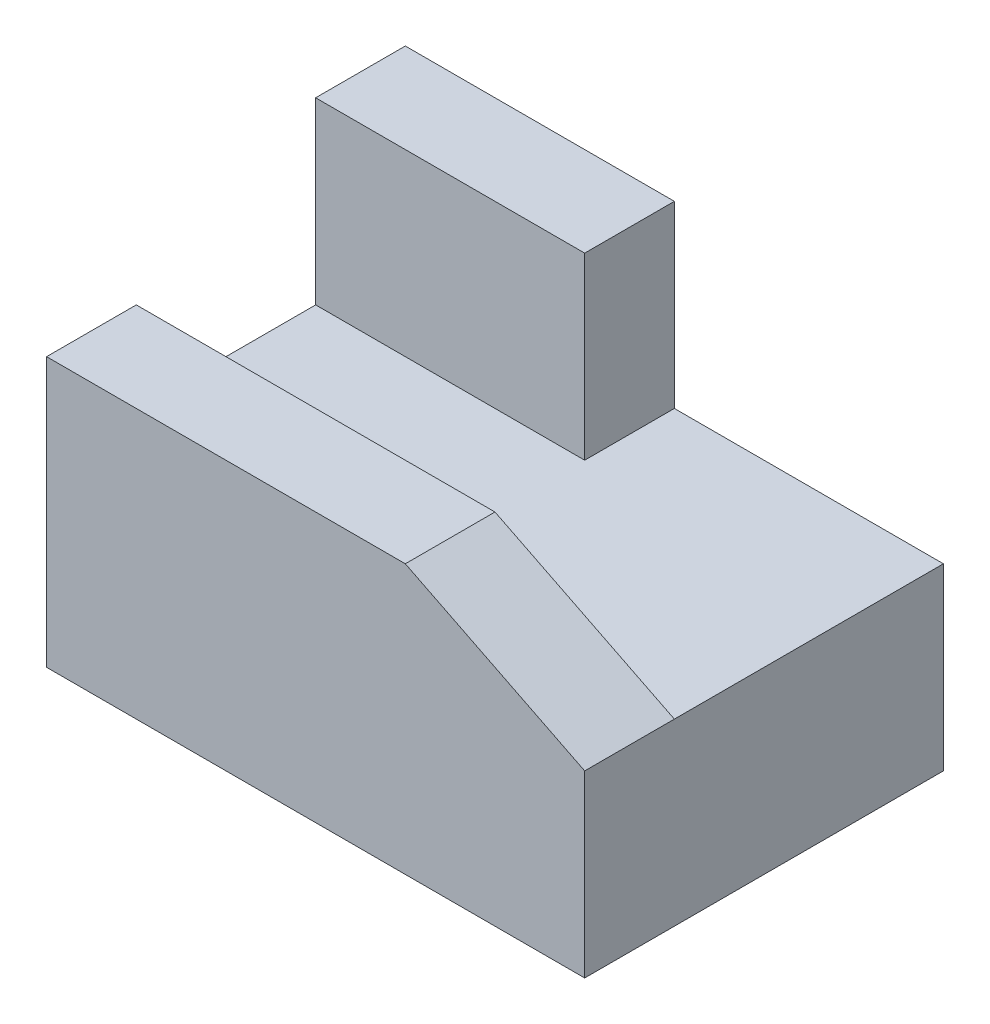
ISO-10303-21;
HEADER;
FILE_DESCRIPTION(('STEP AP214'),'2;1');
FILE_NAME('part.step','',(''),(''),'','','');
FILE_SCHEMA(('AUTOMOTIVE_DESIGN { 1 0 10303 214 1 1 1 1 }'));
ENDSEC;
DATA;
#1=APPLICATION_CONTEXT('core data for automotive mechanical design processes');
#2=APPLICATION_PROTOCOL_DEFINITION('international standard','automotive_design',2000,#1);
#3=PRODUCT_CONTEXT('',#1,'mechanical');
#4=PRODUCT('Part','Part','',(#3));
#5=PRODUCT_RELATED_PRODUCT_CATEGORY('part','',(#4));
#6=PRODUCT_DEFINITION_FORMATION('','',#4);
#7=PRODUCT_DEFINITION_CONTEXT('part definition',#1,'design');
#8=PRODUCT_DEFINITION('design','',#6,#7);
#9=PRODUCT_DEFINITION_SHAPE('','',#8);
#10=(LENGTH_UNIT() NAMED_UNIT(*) SI_UNIT(.MILLI.,.METRE.));
#11=(NAMED_UNIT(*) PLANE_ANGLE_UNIT() SI_UNIT($,.RADIAN.));
#12=(NAMED_UNIT(*) SI_UNIT($,.STERADIAN.) SOLID_ANGLE_UNIT());
#13=UNCERTAINTY_MEASURE_WITH_UNIT(LENGTH_MEASURE(1.E-05),#10,'distance_accuracy_value','');
#14=(GEOMETRIC_REPRESENTATION_CONTEXT(3) GLOBAL_UNCERTAINTY_ASSIGNED_CONTEXT((#13)) GLOBAL_UNIT_ASSIGNED_CONTEXT((#10,
#11,#12)) REPRESENTATION_CONTEXT('',''));
#15=CARTESIAN_POINT('',(0.,0.,0.));
#16=DIRECTION('',(0.,0.,1.));
#17=DIRECTION('',(1.,0.,0.));
#18=AXIS2_PLACEMENT_3D('',#15,#16,#17);
#19=CARTESIAN_POINT('',(0.,20.,0.));
#20=DIRECTION('',(0.,1.,0.));
#21=DIRECTION('',(0.,0.,1.));
#22=AXIS2_PLACEMENT_3D('',#19,#20,#21);
#23=PLANE('',#22);
#24=DIRECTION('',(-1.,0.,0.));
#25=VECTOR('',#24,1.);
#26=CARTESIAN_POINT('',(-30.,20.,-20.));
#27=LINE('',#26,#25);
#28=CARTESIAN_POINT('',(30.,20.,-20.));
#29=VERTEX_POINT('',#28);
#30=CARTESIAN_POINT('',(0.,20.,-20.));
#31=VERTEX_POINT('',#30);
#32=EDGE_CURVE('E186',#29,#31,#27,.T.);
#33=ORIENTED_EDGE('',*,*,#32,.T.);
#34=DIRECTION('',(0.,0.,-1.));
#35=VECTOR('',#34,1.);
#36=CARTESIAN_POINT('',(0.,20.,-10.));
#37=LINE('',#36,#35);
#38=CARTESIAN_POINT('',(0.,20.,-10.));
#39=VERTEX_POINT('',#38);
#40=EDGE_CURVE('E55',#39,#31,#37,.T.);
#41=ORIENTED_EDGE('',*,*,#40,.F.);
#42=DIRECTION('',(1.,0.,0.));
#43=VECTOR('',#42,1.);
#44=CARTESIAN_POINT('',(-30.,20.,-10.));
#45=LINE('',#44,#43);
#46=CARTESIAN_POINT('',(-30.,20.,-10.));
#47=VERTEX_POINT('',#46);
#48=EDGE_CURVE('E60',#47,#39,#45,.T.);
#49=ORIENTED_EDGE('',*,*,#48,.F.);
#50=DIRECTION('',(0.,0.,1.));
#51=VECTOR('',#50,1.);
#52=CARTESIAN_POINT('',(-30.,20.,-20.));
#53=LINE('',#52,#51);
#54=CARTESIAN_POINT('',(-30.,20.,9.99999999999999));
#55=VERTEX_POINT('',#54);
#56=EDGE_CURVE('E190',#47,#55,#53,.T.);
#57=ORIENTED_EDGE('',*,*,#56,.T.);
#58=DIRECTION('',(-1.,0.,0.));
#59=VECTOR('',#58,1.);
#60=CARTESIAN_POINT('',(30.,20.,9.99999999999999));
#61=LINE('',#60,#59);
#62=CARTESIAN_POINT('',(30.,20.,9.99999999999999));
#63=VERTEX_POINT('',#62);
#64=EDGE_CURVE('E164',#63,#55,#61,.T.);
#65=ORIENTED_EDGE('',*,*,#64,.F.);
#66=DIRECTION('',(0.,0.,-1.));
#67=VECTOR('',#66,1.);
#68=CARTESIAN_POINT('',(30.,20.,-20.));
#69=LINE('',#68,#67);
#70=EDGE_CURVE('E187',#63,#29,#69,.T.);
#71=ORIENTED_EDGE('',*,*,#70,.T.);
#72=EDGE_LOOP('',(#33,#41,#49,#57,#65,#71));
#73=FACE_BOUND('',#72,.T.);
#74=ADVANCED_FACE('F39',(#73),#23,.T.);
#75=CARTESIAN_POINT('',(30.,20.,-20.));
#76=DIRECTION('',(-1.,0.,0.));
#77=DIRECTION('',(0.,0.,1.));
#78=AXIS2_PLACEMENT_3D('',#75,#76,#77);
#79=PLANE('',#78);
#80=DIRECTION('',(0.,0.,-1.));
#81=VECTOR('',#80,1.);
#82=CARTESIAN_POINT('',(30.,0.,-20.));
#83=LINE('',#82,#81);
#84=CARTESIAN_POINT('',(30.,0.,20.));
#85=VERTEX_POINT('',#84);
#86=CARTESIAN_POINT('',(30.,0.,-20.));
#87=VERTEX_POINT('',#86);
#88=EDGE_CURVE('E181',#85,#87,#83,.T.);
#89=ORIENTED_EDGE('',*,*,#88,.T.);
#90=DIRECTION('',(0.,-1.,0.));
#91=VECTOR('',#90,1.);
#92=CARTESIAN_POINT('',(30.,20.,-20.));
#93=LINE('',#92,#91);
#94=EDGE_CURVE('E11',#29,#87,#93,.T.);
#95=ORIENTED_EDGE('',*,*,#94,.F.);
#96=ORIENTED_EDGE('',*,*,#70,.F.);
#97=CARTESIAN_POINT('',(30.,20.,20.));
#98=VERTEX_POINT('',#97);
#99=EDGE_CURVE('E182',#98,#63,#69,.T.);
#100=ORIENTED_EDGE('',*,*,#99,.F.);
#101=DIRECTION('',(0.,-1.,0.));
#102=VECTOR('',#101,1.);
#103=CARTESIAN_POINT('',(30.,20.,20.));
#104=LINE('',#103,#102);
#105=EDGE_CURVE('E193',#98,#85,#104,.T.);
#106=ORIENTED_EDGE('',*,*,#105,.T.);
#107=EDGE_LOOP('',(#89,#95,#96,#100,#106));
#108=FACE_BOUND('',#107,.T.);
#109=ADVANCED_FACE('F41',(#108),#79,.F.);
#110=CARTESIAN_POINT('',(-30.,20.,-20.));
#111=DIRECTION('',(0.,0.,1.));
#112=DIRECTION('',(1.,0.,0.));
#113=AXIS2_PLACEMENT_3D('',#110,#111,#112);
#114=PLANE('',#113);
#115=DIRECTION('',(-1.,0.,0.));
#116=VECTOR('',#115,1.);
#117=CARTESIAN_POINT('',(-30.,0.,-20.));
#118=LINE('',#117,#116);
#119=CARTESIAN_POINT('',(-30.,0.,-20.));
#120=VERTEX_POINT('',#119);
#121=EDGE_CURVE('E197',#87,#120,#118,.T.);
#122=ORIENTED_EDGE('',*,*,#121,.T.);
#123=DIRECTION('',(0.,-1.,0.));
#124=VECTOR('',#123,1.);
#125=CARTESIAN_POINT('',(-30.,20.,-20.));
#126=LINE('',#125,#124);
#127=CARTESIAN_POINT('',(-30.,40.,-20.));
#128=VERTEX_POINT('',#127);
#129=EDGE_CURVE('E48',#128,#120,#126,.T.);
#130=ORIENTED_EDGE('',*,*,#129,.F.);
#131=DIRECTION('',(1.,0.,0.));
#132=VECTOR('',#131,1.);
#133=CARTESIAN_POINT('',(-30.,40.,-20.));
#134=LINE('',#133,#132);
#135=CARTESIAN_POINT('',(0.,40.,-20.));
#136=VERTEX_POINT('',#135);
#137=EDGE_CURVE('E144',#128,#136,#134,.T.);
#138=ORIENTED_EDGE('',*,*,#137,.T.);
#139=DIRECTION('',(0.,1.,0.));
#140=VECTOR('',#139,1.);
#141=CARTESIAN_POINT('',(0.,20.,-20.));
#142=LINE('',#141,#140);
#143=EDGE_CURVE('E126',#31,#136,#142,.T.);
#144=ORIENTED_EDGE('',*,*,#143,.F.);
#145=ORIENTED_EDGE('',*,*,#32,.F.);
#146=ORIENTED_EDGE('',*,*,#94,.T.);
#147=EDGE_LOOP('',(#122,#130,#138,#144,#145,#146));
#148=FACE_BOUND('',#147,.T.);
#149=ADVANCED_FACE('F242',(#148),#114,.F.);
#150=CARTESIAN_POINT('',(-30.,20.,-20.));
#151=DIRECTION('',(1.,0.,0.));
#152=DIRECTION('',(0.,0.,-1.));
#153=AXIS2_PLACEMENT_3D('',#150,#151,#152);
#154=PLANE('',#153);
#155=DIRECTION('',(0.,0.,1.));
#156=VECTOR('',#155,1.);
#157=CARTESIAN_POINT('',(-30.,0.,-20.));
#158=LINE('',#157,#156);
#159=CARTESIAN_POINT('',(-30.,0.,20.));
#160=VERTEX_POINT('',#159);
#161=EDGE_CURVE('E200',#120,#160,#158,.T.);
#162=ORIENTED_EDGE('',*,*,#161,.T.);
#163=DIRECTION('',(0.,-1.,0.));
#164=VECTOR('',#163,1.);
#165=CARTESIAN_POINT('',(-30.,20.,20.));
#166=LINE('',#165,#164);
#167=CARTESIAN_POINT('',(-30.,30.,20.));
#168=VERTEX_POINT('',#167);
#169=EDGE_CURVE('E209',#168,#160,#166,.T.);
#170=ORIENTED_EDGE('',*,*,#169,.F.);
#171=DIRECTION('',(0.,0.,1.));
#172=VECTOR('',#171,1.);
#173=CARTESIAN_POINT('',(-30.,30.,9.99999999999999));
#174=LINE('',#173,#172);
#175=CARTESIAN_POINT('',(-30.,30.,9.99999999999999));
#176=VERTEX_POINT('',#175);
#177=EDGE_CURVE('E177',#176,#168,#174,.T.);
#178=ORIENTED_EDGE('',*,*,#177,.F.);
#179=DIRECTION('',(0.,1.,0.));
#180=VECTOR('',#179,1.);
#181=CARTESIAN_POINT('',(-30.,20.,9.99999999999999));
#182=LINE('',#181,#180);
#183=EDGE_CURVE('E152',#55,#176,#182,.T.);
#184=ORIENTED_EDGE('',*,*,#183,.F.);
#185=ORIENTED_EDGE('',*,*,#56,.F.);
#186=DIRECTION('',(0.,1.,0.));
#187=VECTOR('',#186,1.);
#188=CARTESIAN_POINT('',(-30.,20.,-10.));
#189=LINE('',#188,#187);
#190=CARTESIAN_POINT('',(-30.,40.,-10.));
#191=VERTEX_POINT('',#190);
#192=EDGE_CURVE('E136',#47,#191,#189,.T.);
#193=ORIENTED_EDGE('',*,*,#192,.T.);
#194=DIRECTION('',(0.,0.,-1.));
#195=VECTOR('',#194,1.);
#196=CARTESIAN_POINT('',(-30.,40.,-10.));
#197=LINE('',#196,#195);
#198=EDGE_CURVE('E131',#191,#128,#197,.T.);
#199=ORIENTED_EDGE('',*,*,#198,.T.);
#200=ORIENTED_EDGE('',*,*,#129,.T.);
#201=EDGE_LOOP('',(#162,#170,#178,#184,#185,#193,#199,#200));
#202=FACE_BOUND('',#201,.T.);
#203=ADVANCED_FACE('F216',(#202),#154,.F.);
#204=CARTESIAN_POINT('',(-30.,20.,20.));
#205=DIRECTION('',(0.,0.,-1.));
#206=DIRECTION('',(-1.,0.,0.));
#207=AXIS2_PLACEMENT_3D('',#204,#205,#206);
#208=PLANE('',#207);
#209=DIRECTION('',(1.,0.,0.));
#210=VECTOR('',#209,1.);
#211=CARTESIAN_POINT('',(-30.,0.,20.));
#212=LINE('',#211,#210);
#213=EDGE_CURVE('E203',#160,#85,#212,.T.);
#214=ORIENTED_EDGE('',*,*,#213,.T.);
#215=ORIENTED_EDGE('',*,*,#105,.F.);
#216=DIRECTION('',(0.894427190999916,-0.447213595499958,0.));
#217=VECTOR('',#216,1.);
#218=CARTESIAN_POINT('',(10.,30.,20.));
#219=LINE('',#218,#217);
#220=CARTESIAN_POINT('',(10.,30.,20.));
#221=VERTEX_POINT('',#220);
#222=EDGE_CURVE('E157',#221,#98,#219,.T.);
#223=ORIENTED_EDGE('',*,*,#222,.F.);
#224=DIRECTION('',(1.,0.,0.));
#225=VECTOR('',#224,1.);
#226=CARTESIAN_POINT('',(-30.,30.,20.));
#227=LINE('',#226,#225);
#228=EDGE_CURVE('E151',#168,#221,#227,.T.);
#229=ORIENTED_EDGE('',*,*,#228,.F.);
#230=ORIENTED_EDGE('',*,*,#169,.T.);
#231=EDGE_LOOP('',(#214,#215,#223,#229,#230));
#232=FACE_BOUND('',#231,.T.);
#233=ADVANCED_FACE('F223',(#232),#208,.F.);
#234=CARTESIAN_POINT('',(0.,0.,0.));
#235=DIRECTION('',(0.,1.,0.));
#236=DIRECTION('',(0.,0.,1.));
#237=AXIS2_PLACEMENT_3D('',#234,#235,#236);
#238=PLANE('',#237);
#239=ORIENTED_EDGE('',*,*,#88,.F.);
#240=ORIENTED_EDGE('',*,*,#213,.F.);
#241=ORIENTED_EDGE('',*,*,#161,.F.);
#242=ORIENTED_EDGE('',*,*,#121,.F.);
#243=EDGE_LOOP('',(#239,#240,#241,#242));
#244=FACE_BOUND('',#243,.T.);
#245=ADVANCED_FACE('F221',(#244),#238,.F.);
#246=CARTESIAN_POINT('',(-30.,30.,9.99999999999999));
#247=DIRECTION('',(0.,-1.,0.));
#248=DIRECTION('',(0.,0.,-1.));
#249=AXIS2_PLACEMENT_3D('',#246,#247,#248);
#250=PLANE('',#249);
#251=ORIENTED_EDGE('',*,*,#228,.T.);
#252=DIRECTION('',(0.,0.,1.));
#253=VECTOR('',#252,1.);
#254=CARTESIAN_POINT('',(10.,30.,9.99999999999999));
#255=LINE('',#254,#253);
#256=CARTESIAN_POINT('',(10.,30.,9.99999999999999));
#257=VERTEX_POINT('',#256);
#258=EDGE_CURVE('E168',#257,#221,#255,.T.);
#259=ORIENTED_EDGE('',*,*,#258,.F.);
#260=DIRECTION('',(1.,0.,0.));
#261=VECTOR('',#260,1.);
#262=CARTESIAN_POINT('',(-30.,30.,9.99999999999999));
#263=LINE('',#262,#261);
#264=EDGE_CURVE('E156',#176,#257,#263,.T.);
#265=ORIENTED_EDGE('',*,*,#264,.F.);
#266=ORIENTED_EDGE('',*,*,#177,.T.);
#267=EDGE_LOOP('',(#251,#259,#265,#266));
#268=FACE_BOUND('',#267,.T.);
#269=ADVANCED_FACE('F236',(#268),#250,.F.);
#270=CARTESIAN_POINT('',(10.,30.,9.99999999999999));
#271=DIRECTION('',(-0.447213595499958,-0.894427190999916,0.));
#272=DIRECTION('',(0.894427190999916,-0.447213595499958,0.));
#273=AXIS2_PLACEMENT_3D('',#270,#271,#272);
#274=PLANE('',#273);
#275=ORIENTED_EDGE('',*,*,#222,.T.);
#276=ORIENTED_EDGE('',*,*,#99,.T.);
#277=DIRECTION('',(0.894427190999916,-0.447213595499958,0.));
#278=VECTOR('',#277,1.);
#279=CARTESIAN_POINT('',(10.,30.,9.99999999999999));
#280=LINE('',#279,#278);
#281=EDGE_CURVE('E160',#257,#63,#280,.T.);
#282=ORIENTED_EDGE('',*,*,#281,.F.);
#283=ORIENTED_EDGE('',*,*,#258,.T.);
#284=EDGE_LOOP('',(#275,#276,#282,#283));
#285=FACE_BOUND('',#284,.T.);
#286=ADVANCED_FACE('F232',(#285),#274,.F.);
#287=CARTESIAN_POINT('',(0.,0.,9.99999999999999));
#288=DIRECTION('',(0.,0.,-1.));
#289=DIRECTION('',(-1.,0.,0.));
#290=AXIS2_PLACEMENT_3D('',#287,#288,#289);
#291=PLANE('',#290);
#292=ORIENTED_EDGE('',*,*,#183,.T.);
#293=ORIENTED_EDGE('',*,*,#264,.T.);
#294=ORIENTED_EDGE('',*,*,#281,.T.);
#295=ORIENTED_EDGE('',*,*,#64,.T.);
#296=EDGE_LOOP('',(#292,#293,#294,#295));
#297=FACE_BOUND('',#296,.T.);
#298=ADVANCED_FACE('F239',(#297),#291,.T.);
#299=CARTESIAN_POINT('',(0.,20.,-10.));
#300=DIRECTION('',(-1.,0.,0.));
#301=DIRECTION('',(0.,-1.,0.));
#302=AXIS2_PLACEMENT_3D('',#299,#300,#301);
#303=PLANE('',#302);
#304=ORIENTED_EDGE('',*,*,#143,.T.);
#305=DIRECTION('',(0.,0.,-1.));
#306=VECTOR('',#305,1.);
#307=CARTESIAN_POINT('',(0.,40.,-10.));
#308=LINE('',#307,#306);
#309=CARTESIAN_POINT('',(0.,40.,-10.));
#310=VERTEX_POINT('',#309);
#311=EDGE_CURVE('E123',#310,#136,#308,.T.);
#312=ORIENTED_EDGE('',*,*,#311,.F.);
#313=DIRECTION('',(0.,1.,0.));
#314=VECTOR('',#313,1.);
#315=CARTESIAN_POINT('',(0.,20.,-10.));
#316=LINE('',#315,#314);
#317=EDGE_CURVE('E112',#39,#310,#316,.T.);
#318=ORIENTED_EDGE('',*,*,#317,.F.);
#319=ORIENTED_EDGE('',*,*,#40,.T.);
#320=EDGE_LOOP('',(#304,#312,#318,#319));
#321=FACE_BOUND('',#320,.T.);
#322=ADVANCED_FACE('F124',(#321),#303,.F.);
#323=CARTESIAN_POINT('',(-30.,40.,-10.));
#324=DIRECTION('',(0.,1.,0.));
#325=DIRECTION('',(0.,0.,1.));
#326=AXIS2_PLACEMENT_3D('',#323,#324,#325);
#327=PLANE('',#326);
#328=ORIENTED_EDGE('',*,*,#137,.F.);
#329=ORIENTED_EDGE('',*,*,#198,.F.);
#330=DIRECTION('',(1.,0.,0.));
#331=VECTOR('',#330,1.);
#332=CARTESIAN_POINT('',(-30.,40.,-10.));
#333=LINE('',#332,#331);
#334=EDGE_CURVE('E117',#191,#310,#333,.T.);
#335=ORIENTED_EDGE('',*,*,#334,.T.);
#336=ORIENTED_EDGE('',*,*,#311,.T.);
#337=EDGE_LOOP('',(#328,#329,#335,#336));
#338=FACE_BOUND('',#337,.T.);
#339=ADVANCED_FACE('F133',(#338),#327,.T.);
#340=CARTESIAN_POINT('',(0.,0.,-10.));
#341=DIRECTION('',(0.,0.,1.));
#342=DIRECTION('',(1.,0.,0.));
#343=AXIS2_PLACEMENT_3D('',#340,#341,#342);
#344=PLANE('',#343);
#345=ORIENTED_EDGE('',*,*,#48,.T.);
#346=ORIENTED_EDGE('',*,*,#317,.T.);
#347=ORIENTED_EDGE('',*,*,#334,.F.);
#348=ORIENTED_EDGE('',*,*,#192,.F.);
#349=EDGE_LOOP('',(#345,#346,#347,#348));
#350=FACE_BOUND('',#349,.T.);
#351=ADVANCED_FACE('F114',(#350),#344,.T.);
#352=CLOSED_SHELL('',(#74,#109,#149,#203,#233,#245,#269,#286,#298,#322,#339,#351));
#353=MANIFOLD_SOLID_BREP('B2',#352);
#354=ADVANCED_BREP_SHAPE_REPRESENTATION('',(#18,#353),#14);
#355=SHAPE_DEFINITION_REPRESENTATION(#9,#354);
ENDSEC;
END-ISO-10303-21;
